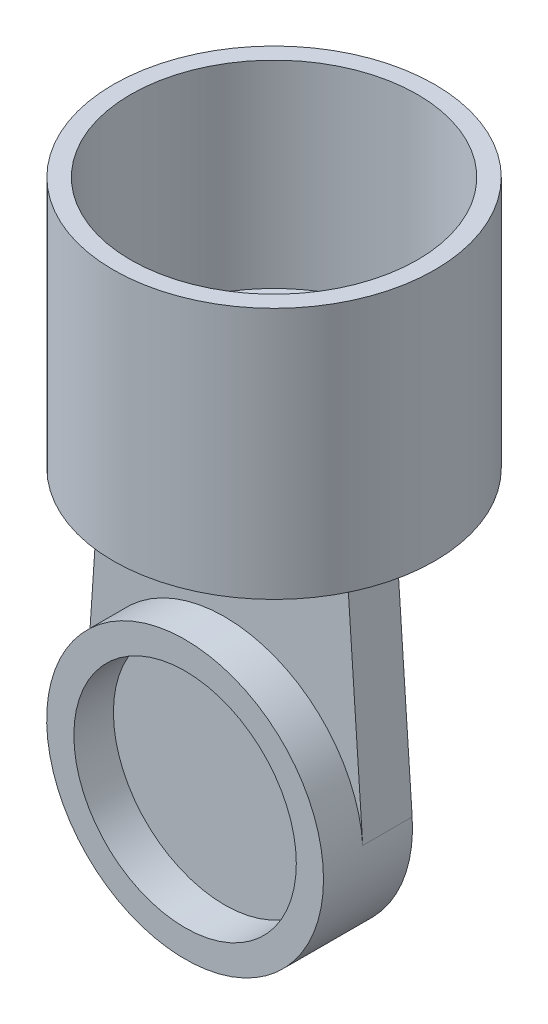
ISO-10303-21;
HEADER;
FILE_DESCRIPTION(('STEP AP214'),'2;1');
FILE_NAME('part.step','',(''),(''),'','','');
FILE_SCHEMA(('AUTOMOTIVE_DESIGN { 1 0 10303 214 1 1 1 1 }'));
ENDSEC;
DATA;
#1=APPLICATION_CONTEXT('core data for automotive mechanical design processes');
#2=APPLICATION_PROTOCOL_DEFINITION('international standard','automotive_design',2000,#1);
#3=PRODUCT_CONTEXT('',#1,'mechanical');
#4=PRODUCT('Part','Part','',(#3));
#5=PRODUCT_RELATED_PRODUCT_CATEGORY('part','',(#4));
#6=PRODUCT_DEFINITION_FORMATION('','',#4);
#7=PRODUCT_DEFINITION_CONTEXT('part definition',#1,'design');
#8=PRODUCT_DEFINITION('design','',#6,#7);
#9=PRODUCT_DEFINITION_SHAPE('','',#8);
#10=(LENGTH_UNIT() NAMED_UNIT(*) SI_UNIT(.MILLI.,.METRE.));
#11=(NAMED_UNIT(*) PLANE_ANGLE_UNIT() SI_UNIT($,.RADIAN.));
#12=(NAMED_UNIT(*) SI_UNIT($,.STERADIAN.) SOLID_ANGLE_UNIT());
#13=UNCERTAINTY_MEASURE_WITH_UNIT(LENGTH_MEASURE(1.E-05),#10,'distance_accuracy_value','');
#14=(GEOMETRIC_REPRESENTATION_CONTEXT(3) GLOBAL_UNCERTAINTY_ASSIGNED_CONTEXT((#13)) GLOBAL_UNIT_ASSIGNED_CONTEXT((#10,
#11,#12)) REPRESENTATION_CONTEXT('',''));
#15=CARTESIAN_POINT('',(0.,0.,0.));
#16=DIRECTION('',(0.,0.,1.));
#17=DIRECTION('',(1.,0.,0.));
#18=AXIS2_PLACEMENT_3D('',#15,#16,#17);
#19=CARTESIAN_POINT('',(-24.,60.,10.));
#20=DIRECTION('',(0.997713780377071,-0.0675811545158382,0.));
#21=DIRECTION('',(0.0675811545158382,0.997713780377071,0.));
#22=AXIS2_PLACEMENT_3D('',#19,#20,#21);
#23=PLANE('',#22);
#24=DIRECTION('',(-0.0675811545158382,-0.997713780377071,0.));
#25=VECTOR('',#24,1.);
#26=CARTESIAN_POINT('',(-24.,60.,10.));
#27=LINE('',#26,#25);
#28=CARTESIAN_POINT('',(-24.7450961531204,49.,10.));
#29=VERTEX_POINT('',#28);
#30=CARTESIAN_POINT('',(-27.935985850558,1.89227232644347,10.));
#31=VERTEX_POINT('',#30);
#32=EDGE_CURVE('E209',#29,#31,#27,.T.);
#33=ORIENTED_EDGE('',*,*,#32,.F.);
#34=DIRECTION('',(0.,0.,-1.));
#35=VECTOR('',#34,1.);
#36=CARTESIAN_POINT('',(-24.7450961531204,49.,10.));
#37=LINE('',#36,#35);
#38=CARTESIAN_POINT('',(-24.7450961531204,49.,0.));
#39=VERTEX_POINT('',#38);
#40=EDGE_CURVE('E192',#29,#39,#37,.T.);
#41=ORIENTED_EDGE('',*,*,#40,.T.);
#42=DIRECTION('',(-0.0675811545158382,-0.997713780377071,0.));
#43=VECTOR('',#42,1.);
#44=CARTESIAN_POINT('',(-24.,60.,0.));
#45=LINE('',#44,#43);
#46=CARTESIAN_POINT('',(-27.935985850558,1.89227232644347,0.));
#47=VERTEX_POINT('',#46);
#48=EDGE_CURVE('E207',#39,#47,#45,.T.);
#49=ORIENTED_EDGE('',*,*,#48,.T.);
#50=DIRECTION('',(0.,0.,-1.));
#51=VECTOR('',#50,1.);
#52=CARTESIAN_POINT('',(-27.935985850558,1.89227232644347,10.));
#53=LINE('',#52,#51);
#54=EDGE_CURVE('E223',#31,#47,#53,.T.);
#55=ORIENTED_EDGE('',*,*,#54,.F.);
#56=EDGE_LOOP('',(#33,#41,#49,#55));
#57=FACE_BOUND('',#56,.T.);
#58=ADVANCED_FACE('F39',(#57),#23,.F.);
#59=CARTESIAN_POINT('',(0.,0.,10.));
#60=DIRECTION('',(0.,0.,-1.));
#61=DIRECTION('',(-1.,0.,0.));
#62=AXIS2_PLACEMENT_3D('',#59,#60,#61);
#63=CYLINDRICAL_SURFACE('',#62,28.);
#64=CARTESIAN_POINT('',(0.,0.,18.));
#65=DIRECTION('',(0.,0.,1.));
#66=DIRECTION('',(1.,0.,0.));
#67=AXIS2_PLACEMENT_3D('',#64,#65,#66);
#68=CIRCLE('',#67,28.);
#69=CARTESIAN_POINT('',(28.,0.,18.));
#70=VERTEX_POINT('',#69);
#71=EDGE_CURVE('E204',#70,#70,#68,.T.);
#72=ORIENTED_EDGE('',*,*,#71,.F.);
#73=EDGE_LOOP('',(#72));
#74=FACE_BOUND('',#73,.T.);
#75=CARTESIAN_POINT('',(0.,0.,10.));
#76=DIRECTION('',(0.,0.,1.));
#77=DIRECTION('',(1.,0.,0.));
#78=AXIS2_PLACEMENT_3D('',#75,#76,#77);
#79=CIRCLE('',#78,28.);
#80=CARTESIAN_POINT('',(27.935985850558,1.89227232644346,10.));
#81=VERTEX_POINT('',#80);
#82=EDGE_CURVE('E201',#81,#31,#79,.T.);
#83=ORIENTED_EDGE('',*,*,#82,.T.);
#84=ORIENTED_EDGE('',*,*,#54,.T.);
#85=CARTESIAN_POINT('',(0.,0.,0.));
#86=DIRECTION('',(0.,0.,1.));
#87=DIRECTION('',(1.,0.,0.));
#88=AXIS2_PLACEMENT_3D('',#85,#86,#87);
#89=CIRCLE('',#88,28.);
#90=CARTESIAN_POINT('',(27.935985850558,1.89227232644346,0.));
#91=VERTEX_POINT('',#90);
#92=EDGE_CURVE('E218',#47,#91,#89,.T.);
#93=ORIENTED_EDGE('',*,*,#92,.T.);
#94=DIRECTION('',(0.,0.,-1.));
#95=VECTOR('',#94,1.);
#96=CARTESIAN_POINT('',(27.935985850558,1.89227232644346,10.));
#97=LINE('',#96,#95);
#98=EDGE_CURVE('E216',#81,#91,#97,.T.);
#99=ORIENTED_EDGE('',*,*,#98,.F.);
#100=EDGE_LOOP('',(#83,#84,#93,#99));
#101=FACE_BOUND('',#100,.T.);
#102=ADVANCED_FACE('F241',(#74,#101),#63,.T.);
#103=CARTESIAN_POINT('',(24.,60.,10.));
#104=DIRECTION('',(-0.997713780377071,-0.0675811545158382,0.));
#105=DIRECTION('',(0.0675811545158382,-0.997713780377071,0.));
#106=AXIS2_PLACEMENT_3D('',#103,#104,#105);
#107=PLANE('',#106);
#108=DIRECTION('',(-0.0675811545158382,0.997713780377071,0.));
#109=VECTOR('',#108,1.);
#110=CARTESIAN_POINT('',(24.,60.,0.));
#111=LINE('',#110,#109);
#112=CARTESIAN_POINT('',(24.7450961531204,49.,0.));
#113=VERTEX_POINT('',#112);
#114=EDGE_CURVE('E213',#91,#113,#111,.T.);
#115=ORIENTED_EDGE('',*,*,#114,.T.);
#116=DIRECTION('',(0.,0.,1.));
#117=VECTOR('',#116,1.);
#118=CARTESIAN_POINT('',(24.7450961531204,49.,10.));
#119=LINE('',#118,#117);
#120=CARTESIAN_POINT('',(24.7450961531204,49.,10.));
#121=VERTEX_POINT('',#120);
#122=EDGE_CURVE('E189',#113,#121,#119,.T.);
#123=ORIENTED_EDGE('',*,*,#122,.T.);
#124=DIRECTION('',(-0.0675811545158382,0.997713780377071,0.));
#125=VECTOR('',#124,1.);
#126=CARTESIAN_POINT('',(24.,60.,10.));
#127=LINE('',#126,#125);
#128=EDGE_CURVE('E212',#81,#121,#127,.T.);
#129=ORIENTED_EDGE('',*,*,#128,.F.);
#130=ORIENTED_EDGE('',*,*,#98,.T.);
#131=EDGE_LOOP('',(#115,#123,#129,#130));
#132=FACE_BOUND('',#131,.T.);
#133=ADVANCED_FACE('F238',(#132),#107,.F.);
#134=CARTESIAN_POINT('',(0.,0.,10.));
#135=DIRECTION('',(0.,0.,1.));
#136=DIRECTION('',(1.,0.,0.));
#137=AXIS2_PLACEMENT_3D('',#134,#135,#136);
#138=PLANE('',#137);
#139=ORIENTED_EDGE('',*,*,#128,.T.);
#140=DIRECTION('',(1.,0.,0.));
#141=VECTOR('',#140,1.);
#142=CARTESIAN_POINT('',(0.,49.,10.));
#143=LINE('',#142,#141);
#144=EDGE_CURVE('E195',#29,#121,#143,.T.);
#145=ORIENTED_EDGE('',*,*,#144,.F.);
#146=ORIENTED_EDGE('',*,*,#32,.T.);
#147=ORIENTED_EDGE('',*,*,#82,.F.);
#148=EDGE_LOOP('',(#139,#145,#146,#147));
#149=FACE_BOUND('',#148,.T.);
#150=ADVANCED_FACE('F243',(#149),#138,.T.);
#151=CARTESIAN_POINT('',(0.,0.,0.));
#152=DIRECTION('',(0.,0.,1.));
#153=DIRECTION('',(1.,0.,0.));
#154=AXIS2_PLACEMENT_3D('',#151,#152,#153);
#155=PLANE('',#154);
#156=DIRECTION('',(1.,0.,0.));
#157=VECTOR('',#156,1.);
#158=CARTESIAN_POINT('',(0.,-15.7900715477192,0.));
#159=LINE('',#158,#157);
#160=CARTESIAN_POINT('',(-4.,-15.7900715477192,0.));
#161=VERTEX_POINT('',#160);
#162=CARTESIAN_POINT('',(4.,-15.7900715477192,0.));
#163=VERTEX_POINT('',#162);
#164=EDGE_CURVE('E174',#161,#163,#159,.T.);
#165=ORIENTED_EDGE('',*,*,#164,.T.);
#166=DIRECTION('',(0.,1.,0.));
#167=VECTOR('',#166,1.);
#168=CARTESIAN_POINT('',(4.,0.,0.));
#169=LINE('',#168,#167);
#170=CARTESIAN_POINT('',(4.,49.,0.));
#171=VERTEX_POINT('',#170);
#172=EDGE_CURVE('E169',#163,#171,#169,.T.);
#173=ORIENTED_EDGE('',*,*,#172,.T.);
#174=DIRECTION('',(1.,0.,0.));
#175=VECTOR('',#174,1.);
#176=CARTESIAN_POINT('',(0.,49.,0.));
#177=LINE('',#176,#175);
#178=EDGE_CURVE('E47',#171,#113,#177,.T.);
#179=ORIENTED_EDGE('',*,*,#178,.T.);
#180=ORIENTED_EDGE('',*,*,#114,.F.);
#181=ORIENTED_EDGE('',*,*,#92,.F.);
#182=ORIENTED_EDGE('',*,*,#48,.F.);
#183=CARTESIAN_POINT('',(-4.,49.,0.));
#184=VERTEX_POINT('',#183);
#185=EDGE_CURVE('E11',#39,#184,#177,.T.);
#186=ORIENTED_EDGE('',*,*,#185,.T.);
#187=DIRECTION('',(0.,1.,0.));
#188=VECTOR('',#187,1.);
#189=CARTESIAN_POINT('',(-4.,0.,0.));
#190=LINE('',#189,#188);
#191=EDGE_CURVE('E165',#161,#184,#190,.T.);
#192=ORIENTED_EDGE('',*,*,#191,.F.);
#193=EDGE_LOOP('',(#165,#173,#179,#180,#181,#182,#186,#192));
#194=FACE_BOUND('',#193,.T.);
#195=ADVANCED_FACE('F232',(#194),#155,.F.);
#196=CARTESIAN_POINT('',(0.,0.,18.));
#197=DIRECTION('',(0.,0.,1.));
#198=DIRECTION('',(1.,0.,0.));
#199=AXIS2_PLACEMENT_3D('',#196,#197,#198);
#200=PLANE('',#199);
#201=CARTESIAN_POINT('',(0.,0.,18.));
#202=DIRECTION('',(0.,0.,1.));
#203=DIRECTION('',(1.,0.,0.));
#204=AXIS2_PLACEMENT_3D('',#201,#202,#203);
#205=CIRCLE('',#204,22.5);
#206=CARTESIAN_POINT('',(22.5,0.,18.));
#207=VERTEX_POINT('',#206);
#208=EDGE_CURVE('E198',#207,#207,#205,.T.);
#209=ORIENTED_EDGE('',*,*,#208,.F.);
#210=EDGE_LOOP('',(#209));
#211=FACE_BOUND('',#210,.T.);
#212=ORIENTED_EDGE('',*,*,#71,.T.);
#213=EDGE_LOOP('',(#212));
#214=FACE_BOUND('',#213,.T.);
#215=ADVANCED_FACE('F279',(#211,#214),#200,.T.);
#216=CARTESIAN_POINT('',(0.,0.,18.));
#217=DIRECTION('',(0.,0.,-1.));
#218=DIRECTION('',(-1.,0.,0.));
#219=AXIS2_PLACEMENT_3D('',#216,#217,#218);
#220=CYLINDRICAL_SURFACE('',#219,22.5);
#221=CARTESIAN_POINT('',(0.,0.,10.));
#222=DIRECTION('',(0.,0.,1.));
#223=DIRECTION('',(1.,0.,0.));
#224=AXIS2_PLACEMENT_3D('',#221,#222,#223);
#225=CIRCLE('',#224,22.5);
#226=CARTESIAN_POINT('',(22.5,0.,10.));
#227=VERTEX_POINT('',#226);
#228=EDGE_CURVE('E197',#227,#227,#225,.T.);
#229=ORIENTED_EDGE('',*,*,#228,.F.);
#230=EDGE_LOOP('',(#229));
#231=FACE_BOUND('',#230,.T.);
#232=ORIENTED_EDGE('',*,*,#208,.T.);
#233=EDGE_LOOP('',(#232));
#234=FACE_BOUND('',#233,.T.);
#235=ADVANCED_FACE('F285',(#231,#234),#220,.F.);
#236=ORIENTED_EDGE('',*,*,#228,.T.);
#237=EDGE_LOOP('',(#236));
#238=FACE_BOUND('',#237,.T.);
#239=ADVANCED_FACE('F282',(#238),#138,.T.);
#240=CARTESIAN_POINT('',(0.,49.,0.));
#241=DIRECTION('',(0.,1.,0.));
#242=DIRECTION('',(0.,0.,1.));
#243=AXIS2_PLACEMENT_3D('',#240,#241,#242);
#244=CYLINDRICAL_SURFACE('',#243,32.5);
#245=CARTESIAN_POINT('',(0.,100.,0.));
#246=DIRECTION('',(0.,1.,0.));
#247=DIRECTION('',(0.,0.,1.));
#248=AXIS2_PLACEMENT_3D('',#245,#246,#247);
#249=CIRCLE('',#248,32.5);
#250=CARTESIAN_POINT('',(0.,100.,32.5));
#251=VERTEX_POINT('',#250);
#252=EDGE_CURVE('E181',#251,#251,#249,.T.);
#253=ORIENTED_EDGE('',*,*,#252,.F.);
#254=EDGE_LOOP('',(#253));
#255=FACE_BOUND('',#254,.T.);
#256=CARTESIAN_POINT('',(0.,49.,0.));
#257=DIRECTION('',(0.,-1.,0.));
#258=DIRECTION('',(0.,0.,-1.));
#259=AXIS2_PLACEMENT_3D('',#256,#257,#258);
#260=CIRCLE('',#259,32.5);
#261=CARTESIAN_POINT('',(0.,49.,-32.5));
#262=VERTEX_POINT('',#261);
#263=EDGE_CURVE('E186',#262,#262,#260,.T.);
#264=ORIENTED_EDGE('',*,*,#263,.F.);
#265=EDGE_LOOP('',(#264));
#266=FACE_BOUND('',#265,.T.);
#267=ADVANCED_FACE('F290',(#255,#266),#244,.T.);
#268=CARTESIAN_POINT('',(0.,49.,0.));
#269=DIRECTION('',(0.,-1.,0.));
#270=DIRECTION('',(0.,0.,-1.));
#271=AXIS2_PLACEMENT_3D('',#268,#269,#270);
#272=PLANE('',#271);
#273=DIRECTION('',(0.,0.,1.));
#274=VECTOR('',#273,1.);
#275=CARTESIAN_POINT('',(12.0073339858559,49.,0.));
#276=LINE('',#275,#274);
#277=CARTESIAN_POINT('',(12.0073339858559,49.,16.71169991315));
#278=VERTEX_POINT('',#277);
#279=CARTESIAN_POINT('',(12.0073339858559,49.,25.8516108576075));
#280=VERTEX_POINT('',#279);
#281=EDGE_CURVE('E154',#278,#280,#276,.T.);
#282=ORIENTED_EDGE('',*,*,#281,.F.);
#283=DIRECTION('',(1.,0.,0.));
#284=VECTOR('',#283,1.);
#285=CARTESIAN_POINT('',(0.,49.,16.71169991315));
#286=LINE('',#285,#284);
#287=CARTESIAN_POINT('',(-12.0073339858559,49.,16.71169991315));
#288=VERTEX_POINT('',#287);
#289=EDGE_CURVE('E147',#288,#278,#286,.T.);
#290=ORIENTED_EDGE('',*,*,#289,.F.);
#291=DIRECTION('',(0.,0.,-1.));
#292=VECTOR('',#291,1.);
#293=CARTESIAN_POINT('',(-12.0073339858559,49.,0.));
#294=LINE('',#293,#292);
#295=CARTESIAN_POINT('',(-12.0073339858559,49.,25.8516108576075));
#296=VERTEX_POINT('',#295);
#297=EDGE_CURVE('E128',#296,#288,#294,.T.);
#298=ORIENTED_EDGE('',*,*,#297,.F.);
#299=DIRECTION('',(-1.,0.,0.));
#300=VECTOR('',#299,1.);
#301=CARTESIAN_POINT('',(0.,49.,25.8516108576075));
#302=LINE('',#301,#300);
#303=EDGE_CURVE('E152',#280,#296,#302,.T.);
#304=ORIENTED_EDGE('',*,*,#303,.F.);
#305=EDGE_LOOP('',(#282,#290,#298,#304));
#306=FACE_BOUND('',#305,.T.);
#307=ORIENTED_EDGE('',*,*,#263,.T.);
#308=EDGE_LOOP('',(#307));
#309=FACE_BOUND('',#308,.T.);
#310=ORIENTED_EDGE('',*,*,#144,.T.);
#311=ORIENTED_EDGE('',*,*,#122,.F.);
#312=ORIENTED_EDGE('',*,*,#178,.F.);
#313=DIRECTION('',(0.,0.,1.));
#314=VECTOR('',#313,1.);
#315=CARTESIAN_POINT('',(4.,49.,0.));
#316=LINE('',#315,#314);
#317=CARTESIAN_POINT('',(4.,49.,-23.9981251464729));
#318=VERTEX_POINT('',#317);
#319=EDGE_CURVE('E167',#318,#171,#316,.T.);
#320=ORIENTED_EDGE('',*,*,#319,.F.);
#321=DIRECTION('',(1.,0.,0.));
#322=VECTOR('',#321,1.);
#323=CARTESIAN_POINT('',(0.,49.,-23.9981251464729));
#324=LINE('',#323,#322);
#325=CARTESIAN_POINT('',(-4.,49.,-23.9981251464729));
#326=VERTEX_POINT('',#325);
#327=EDGE_CURVE('E172',#326,#318,#324,.T.);
#328=ORIENTED_EDGE('',*,*,#327,.F.);
#329=DIRECTION('',(0.,0.,1.));
#330=VECTOR('',#329,1.);
#331=CARTESIAN_POINT('',(-4.,49.,0.));
#332=LINE('',#331,#330);
#333=EDGE_CURVE('E160',#326,#184,#332,.T.);
#334=ORIENTED_EDGE('',*,*,#333,.T.);
#335=ORIENTED_EDGE('',*,*,#185,.F.);
#336=ORIENTED_EDGE('',*,*,#40,.F.);
#337=EDGE_LOOP('',(#310,#311,#312,#320,#328,#334,#335,#336));
#338=FACE_BOUND('',#337,.T.);
#339=ADVANCED_FACE('F235',(#306,#309,#338),#272,.T.);
#340=CARTESIAN_POINT('',(0.,100.,0.));
#341=DIRECTION('',(0.,1.,0.));
#342=DIRECTION('',(0.,0.,1.));
#343=AXIS2_PLACEMENT_3D('',#340,#341,#342);
#344=PLANE('',#343);
#345=CARTESIAN_POINT('',(0.,100.,0.));
#346=DIRECTION('',(0.,1.,0.));
#347=DIRECTION('',(0.,0.,1.));
#348=AXIS2_PLACEMENT_3D('',#345,#346,#347);
#349=CIRCLE('',#348,29.);
#350=CARTESIAN_POINT('',(0.,100.,29.));
#351=VERTEX_POINT('',#350);
#352=EDGE_CURVE('E178',#351,#351,#349,.T.);
#353=ORIENTED_EDGE('',*,*,#352,.F.);
#354=EDGE_LOOP('',(#353));
#355=FACE_BOUND('',#354,.T.);
#356=ORIENTED_EDGE('',*,*,#252,.T.);
#357=EDGE_LOOP('',(#356));
#358=FACE_BOUND('',#357,.T.);
#359=ADVANCED_FACE('F296',(#355,#358),#344,.T.);
#360=CARTESIAN_POINT('',(0.,100.,0.));
#361=DIRECTION('',(0.,-1.,0.));
#362=DIRECTION('',(0.,0.,-1.));
#363=AXIS2_PLACEMENT_3D('',#360,#361,#362);
#364=CYLINDRICAL_SURFACE('',#363,29.);
#365=CARTESIAN_POINT('',(0.,60.,0.));
#366=DIRECTION('',(0.,1.,0.));
#367=DIRECTION('',(0.,0.,1.));
#368=AXIS2_PLACEMENT_3D('',#365,#366,#367);
#369=CIRCLE('',#368,29.);
#370=CARTESIAN_POINT('',(0.,60.,29.));
#371=VERTEX_POINT('',#370);
#372=EDGE_CURVE('E177',#371,#371,#369,.T.);
#373=ORIENTED_EDGE('',*,*,#372,.F.);
#374=EDGE_LOOP('',(#373));
#375=FACE_BOUND('',#374,.T.);
#376=ORIENTED_EDGE('',*,*,#352,.T.);
#377=EDGE_LOOP('',(#376));
#378=FACE_BOUND('',#377,.T.);
#379=ADVANCED_FACE('F300',(#375,#378),#364,.F.);
#380=CARTESIAN_POINT('',(0.,60.,10.));
#381=DIRECTION('',(0.,-1.,0.));
#382=DIRECTION('',(0.,0.,-1.));
#383=AXIS2_PLACEMENT_3D('',#380,#381,#382);
#384=PLANE('',#383);
#385=DIRECTION('',(-1.,0.,0.));
#386=VECTOR('',#385,1.);
#387=CARTESIAN_POINT('',(-12.0073339858559,60.,16.71169991315));
#388=LINE('',#387,#386);
#389=CARTESIAN_POINT('',(12.0073339858559,60.,16.71169991315));
#390=VERTEX_POINT('',#389);
#391=CARTESIAN_POINT('',(-12.0073339858559,60.,16.71169991315));
#392=VERTEX_POINT('',#391);
#393=EDGE_CURVE('E134',#390,#392,#388,.T.);
#394=ORIENTED_EDGE('',*,*,#393,.F.);
#395=DIRECTION('',(0.,0.,-1.));
#396=VECTOR('',#395,1.);
#397=CARTESIAN_POINT('',(12.0073339858559,60.,25.8516108576075));
#398=LINE('',#397,#396);
#399=CARTESIAN_POINT('',(12.0073339858559,60.,25.8516108576075));
#400=VERTEX_POINT('',#399);
#401=EDGE_CURVE('E62',#400,#390,#398,.T.);
#402=ORIENTED_EDGE('',*,*,#401,.F.);
#403=DIRECTION('',(1.,0.,0.));
#404=VECTOR('',#403,1.);
#405=CARTESIAN_POINT('',(-12.0073339858559,60.,25.8516108576075));
#406=LINE('',#405,#404);
#407=CARTESIAN_POINT('',(-12.0073339858559,60.,25.8516108576075));
#408=VERTEX_POINT('',#407);
#409=EDGE_CURVE('E140',#408,#400,#406,.T.);
#410=ORIENTED_EDGE('',*,*,#409,.F.);
#411=DIRECTION('',(0.,0.,1.));
#412=VECTOR('',#411,1.);
#413=CARTESIAN_POINT('',(-12.0073339858559,60.,25.8516108576075));
#414=LINE('',#413,#412);
#415=EDGE_CURVE('E125',#392,#408,#414,.T.);
#416=ORIENTED_EDGE('',*,*,#415,.F.);
#417=EDGE_LOOP('',(#394,#402,#410,#416));
#418=FACE_BOUND('',#417,.T.);
#419=ORIENTED_EDGE('',*,*,#372,.T.);
#420=EDGE_LOOP('',(#419));
#421=FACE_BOUND('',#420,.T.);
#422=ADVANCED_FACE('F41',(#418,#421),#384,.F.);
#423=CARTESIAN_POINT('',(0.,-15.7900715477192,0.));
#424=DIRECTION('',(0.,-0.347337295353395,-0.937740264282487));
#425=DIRECTION('',(0.,0.937740264282487,-0.347337295353395));
#426=AXIS2_PLACEMENT_3D('',#423,#424,#425);
#427=PLANE('',#426);
#428=ORIENTED_EDGE('',*,*,#164,.F.);
#429=DIRECTION('',(0.,0.937740264282487,-0.347337295353395));
#430=VECTOR('',#429,1.);
#431=CARTESIAN_POINT('',(-4.,-15.7900715477192,0.));
#432=LINE('',#431,#430);
#433=EDGE_CURVE('E156',#161,#326,#432,.T.);
#434=ORIENTED_EDGE('',*,*,#433,.T.);
#435=ORIENTED_EDGE('',*,*,#327,.T.);
#436=DIRECTION('',(0.,0.937740264282487,-0.347337295353395));
#437=VECTOR('',#436,1.);
#438=CARTESIAN_POINT('',(4.,-15.7900715477192,0.));
#439=LINE('',#438,#437);
#440=EDGE_CURVE('E157',#163,#318,#439,.T.);
#441=ORIENTED_EDGE('',*,*,#440,.F.);
#442=EDGE_LOOP('',(#428,#434,#435,#441));
#443=FACE_BOUND('',#442,.T.);
#444=ADVANCED_FACE('F253',(#443),#427,.T.);
#445=CARTESIAN_POINT('',(4.,36.,0.));
#446=DIRECTION('',(1.,0.,0.));
#447=DIRECTION('',(0.,0.,-1.));
#448=AXIS2_PLACEMENT_3D('',#445,#446,#447);
#449=PLANE('',#448);
#450=ORIENTED_EDGE('',*,*,#172,.F.);
#451=ORIENTED_EDGE('',*,*,#440,.T.);
#452=ORIENTED_EDGE('',*,*,#319,.T.);
#453=EDGE_LOOP('',(#450,#451,#452));
#454=FACE_BOUND('',#453,.T.);
#455=ADVANCED_FACE('F256',(#454),#449,.T.);
#456=CARTESIAN_POINT('',(-4.,36.,0.));
#457=DIRECTION('',(1.,0.,0.));
#458=DIRECTION('',(0.,0.,-1.));
#459=AXIS2_PLACEMENT_3D('',#456,#457,#458);
#460=PLANE('',#459);
#461=ORIENTED_EDGE('',*,*,#433,.F.);
#462=ORIENTED_EDGE('',*,*,#191,.T.);
#463=ORIENTED_EDGE('',*,*,#333,.F.);
#464=EDGE_LOOP('',(#461,#462,#463));
#465=FACE_BOUND('',#464,.T.);
#466=ADVANCED_FACE('F251',(#465),#460,.F.);
#467=CARTESIAN_POINT('',(12.0073339858559,44.,25.8516108576075));
#468=DIRECTION('',(1.,0.,0.));
#469=DIRECTION('',(0.,0.,-1.));
#470=AXIS2_PLACEMENT_3D('',#467,#468,#469);
#471=PLANE('',#470);
#472=ORIENTED_EDGE('',*,*,#281,.T.);
#473=DIRECTION('',(0.,1.,0.));
#474=VECTOR('',#473,1.);
#475=CARTESIAN_POINT('',(12.0073339858559,44.,25.8516108576075));
#476=LINE('',#475,#474);
#477=EDGE_CURVE('E145',#280,#400,#476,.T.);
#478=ORIENTED_EDGE('',*,*,#477,.T.);
#479=ORIENTED_EDGE('',*,*,#401,.T.);
#480=DIRECTION('',(0.,1.,0.));
#481=VECTOR('',#480,1.);
#482=CARTESIAN_POINT('',(12.0073339858559,44.,16.71169991315));
#483=LINE('',#482,#481);
#484=EDGE_CURVE('E131',#278,#390,#483,.T.);
#485=ORIENTED_EDGE('',*,*,#484,.F.);
#486=EDGE_LOOP('',(#472,#478,#479,#485));
#487=FACE_BOUND('',#486,.T.);
#488=ADVANCED_FACE('F263',(#487),#471,.F.);
#489=CARTESIAN_POINT('',(-12.0073339858559,44.,25.8516108576075));
#490=DIRECTION('',(0.,0.,1.));
#491=DIRECTION('',(1.,0.,0.));
#492=AXIS2_PLACEMENT_3D('',#489,#490,#491);
#493=PLANE('',#492);
#494=ORIENTED_EDGE('',*,*,#303,.T.);
#495=DIRECTION('',(0.,1.,0.));
#496=VECTOR('',#495,1.);
#497=CARTESIAN_POINT('',(-12.0073339858559,44.,25.8516108576075));
#498=LINE('',#497,#496);
#499=EDGE_CURVE('E130',#296,#408,#498,.T.);
#500=ORIENTED_EDGE('',*,*,#499,.T.);
#501=ORIENTED_EDGE('',*,*,#409,.T.);
#502=ORIENTED_EDGE('',*,*,#477,.F.);
#503=EDGE_LOOP('',(#494,#500,#501,#502));
#504=FACE_BOUND('',#503,.T.);
#505=ADVANCED_FACE('F328',(#504),#493,.F.);
#506=CARTESIAN_POINT('',(-12.0073339858559,44.,25.8516108576075));
#507=DIRECTION('',(-1.,0.,0.));
#508=DIRECTION('',(0.,0.,1.));
#509=AXIS2_PLACEMENT_3D('',#506,#507,#508);
#510=PLANE('',#509);
#511=ORIENTED_EDGE('',*,*,#297,.T.);
#512=DIRECTION('',(0.,1.,0.));
#513=VECTOR('',#512,1.);
#514=CARTESIAN_POINT('',(-12.0073339858559,44.,16.71169991315));
#515=LINE('',#514,#513);
#516=EDGE_CURVE('E54',#288,#392,#515,.T.);
#517=ORIENTED_EDGE('',*,*,#516,.T.);
#518=ORIENTED_EDGE('',*,*,#415,.T.);
#519=ORIENTED_EDGE('',*,*,#499,.F.);
#520=EDGE_LOOP('',(#511,#517,#518,#519));
#521=FACE_BOUND('',#520,.T.);
#522=ADVANCED_FACE('F122',(#521),#510,.F.);
#523=CARTESIAN_POINT('',(-12.0073339858559,44.,16.71169991315));
#524=DIRECTION('',(0.,0.,-1.));
#525=DIRECTION('',(-1.,0.,0.));
#526=AXIS2_PLACEMENT_3D('',#523,#524,#525);
#527=PLANE('',#526);
#528=ORIENTED_EDGE('',*,*,#289,.T.);
#529=ORIENTED_EDGE('',*,*,#484,.T.);
#530=ORIENTED_EDGE('',*,*,#393,.T.);
#531=ORIENTED_EDGE('',*,*,#516,.F.);
#532=EDGE_LOOP('',(#528,#529,#530,#531));
#533=FACE_BOUND('',#532,.T.);
#534=ADVANCED_FACE('F135',(#533),#527,.F.);
#535=CLOSED_SHELL('',(#58,#102,#133,#150,#195,#215,#235,#239,#267,#339,#359,#379,#422,#444,#455,
#466,#488,#505,#522,#534));
#536=MANIFOLD_SOLID_BREP('B2',#535);
#537=ADVANCED_BREP_SHAPE_REPRESENTATION('',(#18,#536),#14);
#538=SHAPE_DEFINITION_REPRESENTATION(#9,#537);
ENDSEC;
END-ISO-10303-21;
